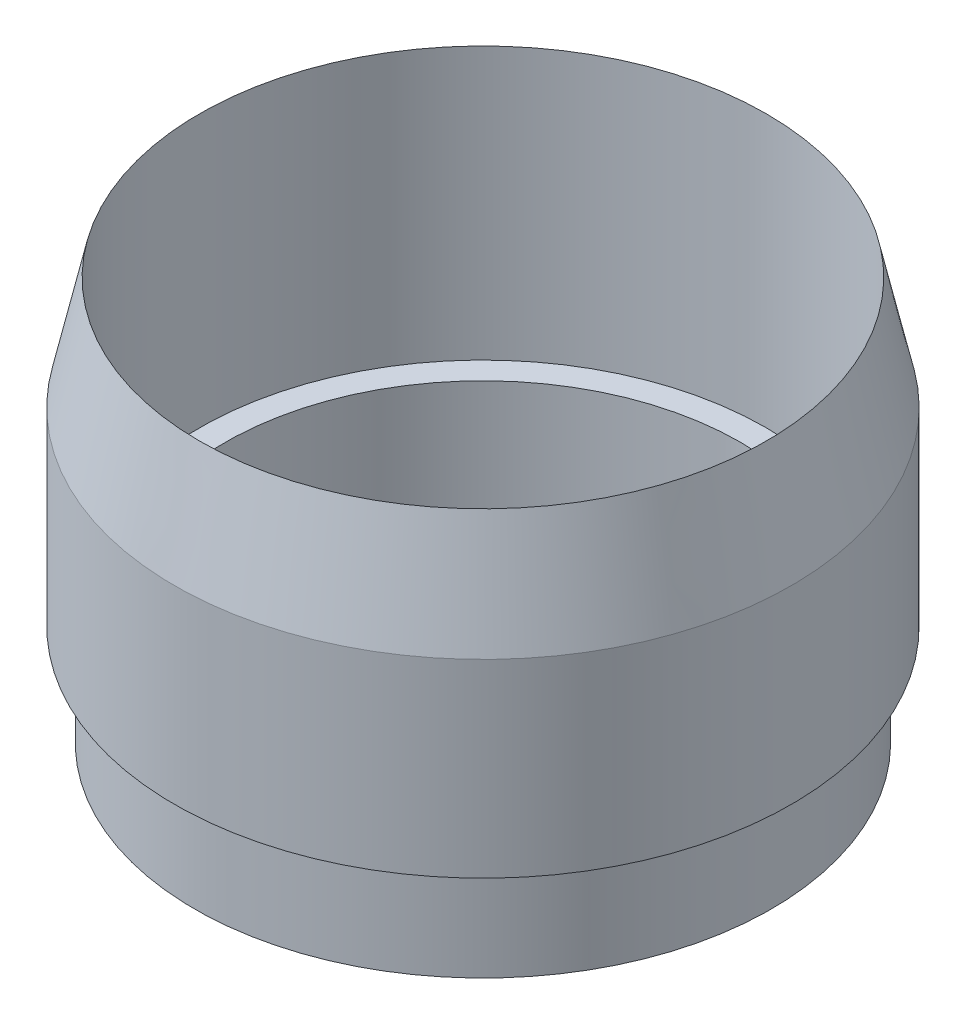
ISO-10303-21;
HEADER;
FILE_DESCRIPTION(('STEP AP214'),'2;1');
FILE_NAME('part.step','',(''),(''),'','','');
FILE_SCHEMA(('AUTOMOTIVE_DESIGN { 1 0 10303 214 1 1 1 1 }'));
ENDSEC;
DATA;
#1=APPLICATION_CONTEXT('core data for automotive mechanical design processes');
#2=APPLICATION_PROTOCOL_DEFINITION('international standard','automotive_design',2000,#1);
#3=PRODUCT_CONTEXT('',#1,'mechanical');
#4=PRODUCT('Part','Part','',(#3));
#5=PRODUCT_RELATED_PRODUCT_CATEGORY('part','',(#4));
#6=PRODUCT_DEFINITION_FORMATION('','',#4);
#7=PRODUCT_DEFINITION_CONTEXT('part definition',#1,'design');
#8=PRODUCT_DEFINITION('design','',#6,#7);
#9=PRODUCT_DEFINITION_SHAPE('','',#8);
#10=(LENGTH_UNIT() NAMED_UNIT(*) SI_UNIT(.MILLI.,.METRE.));
#11=(NAMED_UNIT(*) PLANE_ANGLE_UNIT() SI_UNIT($,.RADIAN.));
#12=(NAMED_UNIT(*) SI_UNIT($,.STERADIAN.) SOLID_ANGLE_UNIT());
#13=UNCERTAINTY_MEASURE_WITH_UNIT(LENGTH_MEASURE(1.E-05),#10,'distance_accuracy_value','');
#14=(GEOMETRIC_REPRESENTATION_CONTEXT(3) GLOBAL_UNCERTAINTY_ASSIGNED_CONTEXT((#13)) GLOBAL_UNIT_ASSIGNED_CONTEXT((#10,
#11,#12)) REPRESENTATION_CONTEXT('',''));
#15=CARTESIAN_POINT('',(0.,0.,0.));
#16=DIRECTION('',(0.,0.,1.));
#17=DIRECTION('',(1.,0.,0.));
#18=AXIS2_PLACEMENT_3D('',#15,#16,#17);
#19=CARTESIAN_POINT('',(0.,40.,0.));
#20=DIRECTION('',(0.,-1.,0.));
#21=DIRECTION('',(0.,0.,-1.));
#22=AXIS2_PLACEMENT_3D('',#19,#20,#21);
#23=CONICAL_SURFACE('',#22,28.135,0.218166156499284);
#24=CARTESIAN_POINT('',(0.,28.8089322024141,0.));
#25=DIRECTION('',(0.,-1.,0.));
#26=DIRECTION('',(0.,0.,-1.));
#27=AXIS2_PLACEMENT_3D('',#24,#25,#26);
#28=CIRCLE('',#27,30.616);
#29=CARTESIAN_POINT('',(0.,28.8089322024141,-30.616));
#30=VERTEX_POINT('',#29);
#31=EDGE_CURVE('E65',#30,#30,#28,.T.);
#32=ORIENTED_EDGE('',*,*,#31,.F.);
#33=EDGE_LOOP('',(#32));
#34=FACE_BOUND('',#33,.T.);
#35=CARTESIAN_POINT('',(0.,40.,0.));
#36=DIRECTION('',(0.,-1.,0.));
#37=DIRECTION('',(0.,0.,-1.));
#38=AXIS2_PLACEMENT_3D('',#35,#36,#37);
#39=CIRCLE('',#38,28.135);
#40=CARTESIAN_POINT('',(0.,40.,-28.135));
#41=VERTEX_POINT('',#40);
#42=EDGE_CURVE('E10',#41,#41,#39,.T.);
#43=ORIENTED_EDGE('',*,*,#42,.T.);
#44=EDGE_LOOP('',(#43));
#45=FACE_BOUND('',#44,.T.);
#46=ADVANCED_FACE('F37',(#34,#45),#23,.T.);
#47=CARTESIAN_POINT('',(0.,0.,0.));
#48=DIRECTION('',(0.,-1.,0.));
#49=DIRECTION('',(0.,0.,-1.));
#50=AXIS2_PLACEMENT_3D('',#47,#48,#49);
#51=CYLINDRICAL_SURFACE('',#50,28.135);
#52=ORIENTED_EDGE('',*,*,#42,.F.);
#53=EDGE_LOOP('',(#52));
#54=FACE_BOUND('',#53,.T.);
#55=CARTESIAN_POINT('',(0.,13.,0.));
#56=DIRECTION('',(0.,-1.,0.));
#57=DIRECTION('',(0.,0.,-1.));
#58=AXIS2_PLACEMENT_3D('',#55,#56,#57);
#59=CIRCLE('',#58,28.135);
#60=CARTESIAN_POINT('',(0.,13.,-28.135));
#61=VERTEX_POINT('',#60);
#62=EDGE_CURVE('E43',#61,#61,#59,.T.);
#63=ORIENTED_EDGE('',*,*,#62,.T.);
#64=EDGE_LOOP('',(#63));
#65=FACE_BOUND('',#64,.T.);
#66=ADVANCED_FACE('F72',(#54,#65),#51,.F.);
#67=CARTESIAN_POINT('',(-28.135,13.,0.));
#68=DIRECTION('',(0.,-1.,0.));
#69=DIRECTION('',(0.,0.,-1.));
#70=AXIS2_PLACEMENT_3D('',#67,#68,#69);
#71=PLANE('',#70);
#72=ORIENTED_EDGE('',*,*,#62,.F.);
#73=EDGE_LOOP('',(#72));
#74=FACE_BOUND('',#73,.T.);
#75=CARTESIAN_POINT('',(0.,13.,0.));
#76=DIRECTION('',(0.,-1.,0.));
#77=DIRECTION('',(0.,0.,-1.));
#78=AXIS2_PLACEMENT_3D('',#75,#76,#77);
#79=CIRCLE('',#78,25.616);
#80=CARTESIAN_POINT('',(0.,13.,-25.616));
#81=VERTEX_POINT('',#80);
#82=EDGE_CURVE('E47',#81,#81,#79,.T.);
#83=ORIENTED_EDGE('',*,*,#82,.T.);
#84=EDGE_LOOP('',(#83));
#85=FACE_BOUND('',#84,.T.);
#86=ADVANCED_FACE('F76',(#74,#85),#71,.F.);
#87=CARTESIAN_POINT('',(0.,0.,0.));
#88=DIRECTION('',(0.,-1.,0.));
#89=DIRECTION('',(0.,0.,-1.));
#90=AXIS2_PLACEMENT_3D('',#87,#88,#89);
#91=CYLINDRICAL_SURFACE('',#90,25.616);
#92=ORIENTED_EDGE('',*,*,#82,.F.);
#93=EDGE_LOOP('',(#92));
#94=FACE_BOUND('',#93,.T.);
#95=CARTESIAN_POINT('',(0.,0.,0.));
#96=DIRECTION('',(0.,-1.,0.));
#97=DIRECTION('',(0.,0.,-1.));
#98=AXIS2_PLACEMENT_3D('',#95,#96,#97);
#99=CIRCLE('',#98,25.616);
#100=CARTESIAN_POINT('',(0.,0.,-25.616));
#101=VERTEX_POINT('',#100);
#102=EDGE_CURVE('E51',#101,#101,#99,.T.);
#103=ORIENTED_EDGE('',*,*,#102,.T.);
#104=EDGE_LOOP('',(#103));
#105=FACE_BOUND('',#104,.T.);
#106=ADVANCED_FACE('F81',(#94,#105),#91,.F.);
#107=CARTESIAN_POINT('',(-28.616,0.,0.));
#108=DIRECTION('',(0.,1.,0.));
#109=DIRECTION('',(0.,0.,1.));
#110=AXIS2_PLACEMENT_3D('',#107,#108,#109);
#111=PLANE('',#110);
#112=ORIENTED_EDGE('',*,*,#102,.F.);
#113=EDGE_LOOP('',(#112));
#114=FACE_BOUND('',#113,.T.);
#115=CARTESIAN_POINT('',(0.,0.,0.));
#116=DIRECTION('',(0.,-1.,0.));
#117=DIRECTION('',(0.,0.,-1.));
#118=AXIS2_PLACEMENT_3D('',#115,#116,#117);
#119=CIRCLE('',#118,28.616);
#120=CARTESIAN_POINT('',(0.,0.,-28.616));
#121=VERTEX_POINT('',#120);
#122=EDGE_CURVE('E56',#121,#121,#119,.T.);
#123=ORIENTED_EDGE('',*,*,#122,.T.);
#124=EDGE_LOOP('',(#123));
#125=FACE_BOUND('',#124,.T.);
#126=ADVANCED_FACE('F87',(#114,#125),#111,.F.);
#127=CARTESIAN_POINT('',(0.,0.,0.));
#128=DIRECTION('',(0.,-1.,0.));
#129=DIRECTION('',(0.,0.,-1.));
#130=AXIS2_PLACEMENT_3D('',#127,#128,#129);
#131=CYLINDRICAL_SURFACE('',#130,28.616);
#132=ORIENTED_EDGE('',*,*,#122,.F.);
#133=EDGE_LOOP('',(#132));
#134=FACE_BOUND('',#133,.T.);
#135=CARTESIAN_POINT('',(0.,10.,0.));
#136=DIRECTION('',(0.,-1.,0.));
#137=DIRECTION('',(0.,0.,-1.));
#138=AXIS2_PLACEMENT_3D('',#135,#136,#137);
#139=CIRCLE('',#138,28.616);
#140=CARTESIAN_POINT('',(0.,10.,-28.616));
#141=VERTEX_POINT('',#140);
#142=EDGE_CURVE('E59',#141,#141,#139,.T.);
#143=ORIENTED_EDGE('',*,*,#142,.T.);
#144=EDGE_LOOP('',(#143));
#145=FACE_BOUND('',#144,.T.);
#146=ADVANCED_FACE('F91',(#134,#145),#131,.T.);
#147=CARTESIAN_POINT('',(-30.616,10.,0.));
#148=DIRECTION('',(0.,1.,0.));
#149=DIRECTION('',(0.,0.,1.));
#150=AXIS2_PLACEMENT_3D('',#147,#148,#149);
#151=PLANE('',#150);
#152=ORIENTED_EDGE('',*,*,#142,.F.);
#153=EDGE_LOOP('',(#152));
#154=FACE_BOUND('',#153,.T.);
#155=CARTESIAN_POINT('',(0.,10.,0.));
#156=DIRECTION('',(0.,-1.,0.));
#157=DIRECTION('',(0.,0.,-1.));
#158=AXIS2_PLACEMENT_3D('',#155,#156,#157);
#159=CIRCLE('',#158,30.616);
#160=CARTESIAN_POINT('',(0.,10.,-30.616));
#161=VERTEX_POINT('',#160);
#162=EDGE_CURVE('E62',#161,#161,#159,.T.);
#163=ORIENTED_EDGE('',*,*,#162,.T.);
#164=EDGE_LOOP('',(#163));
#165=FACE_BOUND('',#164,.T.);
#166=ADVANCED_FACE('F95',(#154,#165),#151,.F.);
#167=CARTESIAN_POINT('',(0.,0.,0.));
#168=DIRECTION('',(0.,-1.,0.));
#169=DIRECTION('',(0.,0.,-1.));
#170=AXIS2_PLACEMENT_3D('',#167,#168,#169);
#171=CYLINDRICAL_SURFACE('',#170,30.616);
#172=ORIENTED_EDGE('',*,*,#162,.F.);
#173=EDGE_LOOP('',(#172));
#174=FACE_BOUND('',#173,.T.);
#175=ORIENTED_EDGE('',*,*,#31,.T.);
#176=EDGE_LOOP('',(#175));
#177=FACE_BOUND('',#176,.T.);
#178=ADVANCED_FACE('F69',(#174,#177),#171,.T.);
#179=CLOSED_SHELL('',(#46,#66,#86,#106,#126,#146,#166,#178));
#180=MANIFOLD_SOLID_BREP('B2',#179);
#181=ADVANCED_BREP_SHAPE_REPRESENTATION('',(#18,#180),#14);
#182=SHAPE_DEFINITION_REPRESENTATION(#9,#181);
ENDSEC;
END-ISO-10303-21;
